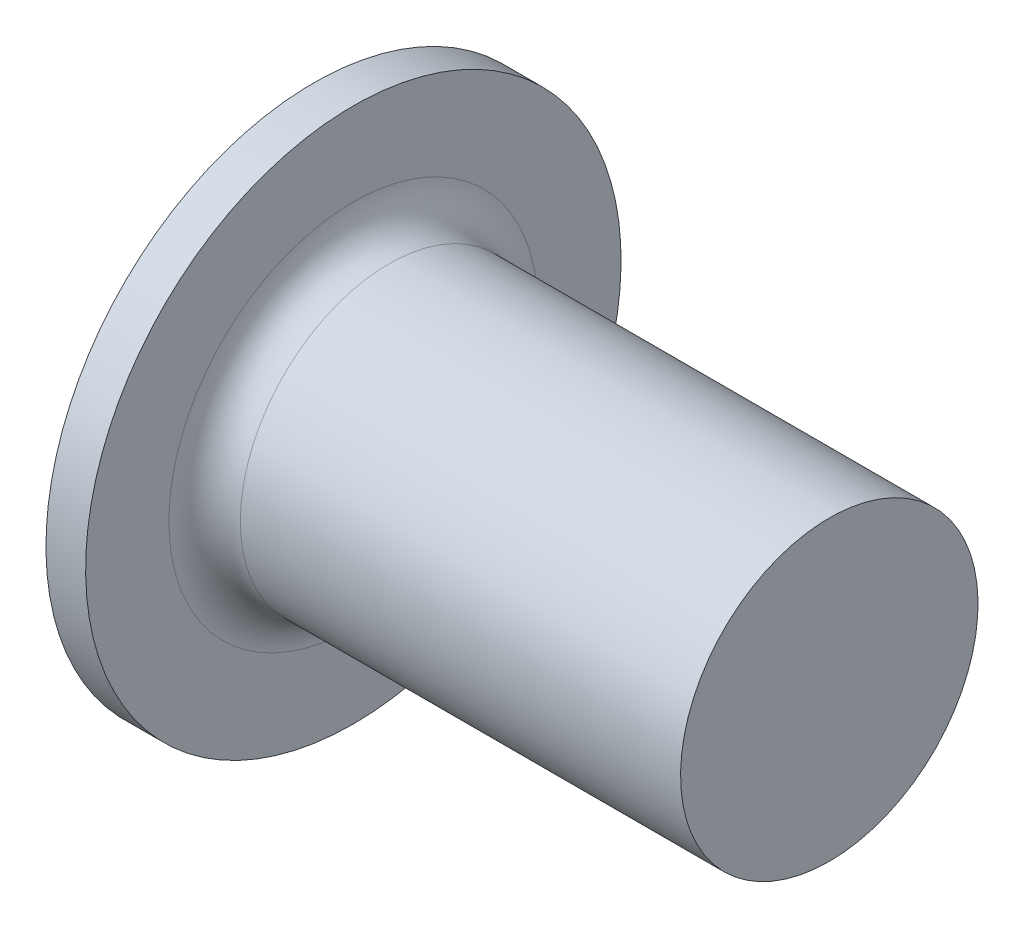
ISO-10303-21;
HEADER;
FILE_DESCRIPTION(('STEP AP214'),'2;1');
FILE_NAME('part.step','',(''),(''),'','','');
FILE_SCHEMA(('AUTOMOTIVE_DESIGN { 1 0 10303 214 1 1 1 1 }'));
ENDSEC;
DATA;
#1=APPLICATION_CONTEXT('core data for automotive mechanical design processes');
#2=APPLICATION_PROTOCOL_DEFINITION('international standard','automotive_design',2000,#1);
#3=PRODUCT_CONTEXT('',#1,'mechanical');
#4=PRODUCT('Part','Part','',(#3));
#5=PRODUCT_RELATED_PRODUCT_CATEGORY('part','',(#4));
#6=PRODUCT_DEFINITION_FORMATION('','',#4);
#7=PRODUCT_DEFINITION_CONTEXT('part definition',#1,'design');
#8=PRODUCT_DEFINITION('design','',#6,#7);
#9=PRODUCT_DEFINITION_SHAPE('','',#8);
#10=(LENGTH_UNIT() NAMED_UNIT(*) SI_UNIT(.MILLI.,.METRE.));
#11=(NAMED_UNIT(*) PLANE_ANGLE_UNIT() SI_UNIT($,.RADIAN.));
#12=(NAMED_UNIT(*) SI_UNIT($,.STERADIAN.) SOLID_ANGLE_UNIT());
#13=UNCERTAINTY_MEASURE_WITH_UNIT(LENGTH_MEASURE(1.E-05),#10,'distance_accuracy_value','');
#14=(GEOMETRIC_REPRESENTATION_CONTEXT(3) GLOBAL_UNCERTAINTY_ASSIGNED_CONTEXT((#13)) GLOBAL_UNIT_ASSIGNED_CONTEXT((#10,
#11,#12)) REPRESENTATION_CONTEXT('',''));
#15=CARTESIAN_POINT('',(0.,0.,0.));
#16=DIRECTION('',(0.,0.,1.));
#17=DIRECTION('',(1.,0.,0.));
#18=AXIS2_PLACEMENT_3D('',#15,#16,#17);
#19=CARTESIAN_POINT('',(-1.,0.,0.));
#20=DIRECTION('',(1.,0.,0.));
#21=DIRECTION('',(0.,1.,0.));
#22=AXIS2_PLACEMENT_3D('',#19,#20,#21);
#23=PLANE('',#22);
#24=CARTESIAN_POINT('',(-1.,0.,0.));
#25=DIRECTION('',(-1.,0.,0.));
#26=DIRECTION('',(0.,-1.,0.));
#27=AXIS2_PLACEMENT_3D('',#24,#25,#26);
#28=CIRCLE('',#27,3.92264973081038);
#29=CARTESIAN_POINT('',(-0.999999999999999,-3.92264973081038,0.));
#30=VERTEX_POINT('',#29);
#31=EDGE_CURVE('E212',#30,#30,#28,.T.);
#32=ORIENTED_EDGE('',*,*,#31,.T.);
#33=EDGE_LOOP('',(#32));
#34=FACE_BOUND('',#33,.T.);
#35=CARTESIAN_POINT('',(-1.,1.34625624391802,0.777261404824292));
#36=DIRECTION('',(-1.,0.,0.));
#37=DIRECTION('',(0.,0.,-1.));
#38=AXIS2_PLACEMENT_3D('',#35,#36,#37);
#39=CIRCLE('',#38,0.52952280964857);
#40=CARTESIAN_POINT('',(-1.,1.19825813867375,0.268841335607677));
#41=VERTEX_POINT('',#40);
#42=CARTESIAN_POINT('',(-1.,0.831952495560455,0.903301320579097));
#43=VERTEX_POINT('',#42);
#44=EDGE_CURVE('E51',#41,#43,#39,.T.);
#45=ORIENTED_EDGE('',*,*,#44,.T.);
#46=CARTESIAN_POINT('',(-1.,0.559999999999994,0.969948452238575));
#47=DIRECTION('',(1.,0.,0.));
#48=DIRECTION('',(0.,0.,-1.));
#49=AXIS2_PLACEMENT_3D('',#46,#47,#48);
#50=CIRCLE('',#49,0.279999999999998);
#51=CARTESIAN_POINT('',(-1.,0.366305643113291,1.17214265618677));
#52=VERTEX_POINT('',#51);
#53=EDGE_CURVE('E159',#43,#52,#50,.T.);
#54=ORIENTED_EDGE('',*,*,#53,.T.);
#55=CARTESIAN_POINT('',(-1.,0.,1.55452280964857));
#56=DIRECTION('',(-1.,0.,0.));
#57=DIRECTION('',(0.,0.,-1.));
#58=AXIS2_PLACEMENT_3D('',#55,#56,#57);
#59=CIRCLE('',#58,0.529522809648569);
#60=CARTESIAN_POINT('',(-1.,-0.366305643113293,1.17214265618677));
#61=VERTEX_POINT('',#60);
#62=EDGE_CURVE('E162',#52,#61,#59,.T.);
#63=ORIENTED_EDGE('',*,*,#62,.T.);
#64=CARTESIAN_POINT('',(-1.,-0.560000000000001,0.96994845223857));
#65=DIRECTION('',(1.,0.,0.));
#66=DIRECTION('',(0.,0.,-1.));
#67=AXIS2_PLACEMENT_3D('',#64,#65,#66);
#68=CIRCLE('',#67,0.280000000000001);
#69=CARTESIAN_POINT('',(-1.,-0.831952495560467,0.903301320579085));
#70=VERTEX_POINT('',#69);
#71=EDGE_CURVE('E165',#61,#70,#68,.T.);
#72=ORIENTED_EDGE('',*,*,#71,.T.);
#73=CARTESIAN_POINT('',(-1.,-1.34625624391801,0.777261404824274));
#74=DIRECTION('',(-1.,0.,0.));
#75=DIRECTION('',(0.,0.,-1.));
#76=AXIS2_PLACEMENT_3D('',#73,#74,#75);
#77=CIRCLE('',#76,0.529522809648555);
#78=CARTESIAN_POINT('',(-1.,-1.19825813867375,0.268841335607678));
#79=VERTEX_POINT('',#78);
#80=EDGE_CURVE('E168',#70,#79,#77,.T.);
#81=ORIENTED_EDGE('',*,*,#80,.T.);
#82=CARTESIAN_POINT('',(-1.,-1.12,0.));
#83=DIRECTION('',(1.,0.,0.));
#84=DIRECTION('',(0.,0.,-1.));
#85=AXIS2_PLACEMENT_3D('',#82,#83,#84);
#86=CIRCLE('',#85,0.280000000000001);
#87=CARTESIAN_POINT('',(-1.,-1.19825813867376,-0.26884133560768));
#88=VERTEX_POINT('',#87);
#89=EDGE_CURVE('E171',#79,#88,#86,.T.);
#90=ORIENTED_EDGE('',*,*,#89,.T.);
#91=CARTESIAN_POINT('',(-1.,-1.34625624391802,-0.777261404824292));
#92=DIRECTION('',(-1.,0.,0.));
#93=DIRECTION('',(0.,0.,-1.));
#94=AXIS2_PLACEMENT_3D('',#91,#92,#93);
#95=CIRCLE('',#94,0.52952280964857);
#96=CARTESIAN_POINT('',(-1.,-0.831952495560455,-0.903301320579097));
#97=VERTEX_POINT('',#96);
#98=EDGE_CURVE('E174',#88,#97,#95,.T.);
#99=ORIENTED_EDGE('',*,*,#98,.T.);
#100=CARTESIAN_POINT('',(-1.,-0.559999999999994,-0.969948452238575));
#101=DIRECTION('',(1.,0.,0.));
#102=DIRECTION('',(0.,0.,-1.));
#103=AXIS2_PLACEMENT_3D('',#100,#101,#102);
#104=CIRCLE('',#103,0.279999999999997);
#105=CARTESIAN_POINT('',(-1.,-0.366305643113292,-1.17214265618677));
#106=VERTEX_POINT('',#105);
#107=EDGE_CURVE('E177',#97,#106,#104,.T.);
#108=ORIENTED_EDGE('',*,*,#107,.T.);
#109=CARTESIAN_POINT('',(-1.,0.,-1.55452280964857));
#110=DIRECTION('',(-1.,0.,0.));
#111=DIRECTION('',(0.,0.,-1.));
#112=AXIS2_PLACEMENT_3D('',#109,#110,#111);
#113=CIRCLE('',#112,0.529522809648569);
#114=CARTESIAN_POINT('',(-1.,0.366305643113294,-1.17214265618677));
#115=VERTEX_POINT('',#114);
#116=EDGE_CURVE('E180',#106,#115,#113,.T.);
#117=ORIENTED_EDGE('',*,*,#116,.T.);
#118=CARTESIAN_POINT('',(-1.,0.560000000000001,-0.96994845223857));
#119=DIRECTION('',(1.,0.,0.));
#120=DIRECTION('',(0.,0.,-1.));
#121=AXIS2_PLACEMENT_3D('',#118,#119,#120);
#122=CIRCLE('',#121,0.28);
#123=CARTESIAN_POINT('',(-1.,0.831952495560466,-0.903301320579089));
#124=VERTEX_POINT('',#123);
#125=EDGE_CURVE('E183',#115,#124,#122,.T.);
#126=ORIENTED_EDGE('',*,*,#125,.T.);
#127=CARTESIAN_POINT('',(-1.,1.34625624391802,-0.777261404824281));
#128=DIRECTION('',(-1.,0.,0.));
#129=DIRECTION('',(0.,0.,-1.));
#130=AXIS2_PLACEMENT_3D('',#127,#128,#129);
#131=CIRCLE('',#130,0.529522809648569);
#132=CARTESIAN_POINT('',(-1.,1.19825813867376,-0.268841335607676));
#133=VERTEX_POINT('',#132);
#134=EDGE_CURVE('E149',#124,#133,#131,.T.);
#135=ORIENTED_EDGE('',*,*,#134,.T.);
#136=CARTESIAN_POINT('',(-1.,1.12,0.));
#137=DIRECTION('',(1.,0.,0.));
#138=DIRECTION('',(0.,0.,-1.));
#139=AXIS2_PLACEMENT_3D('',#136,#137,#138);
#140=CIRCLE('',#139,0.28);
#141=EDGE_CURVE('E186',#133,#41,#140,.T.);
#142=ORIENTED_EDGE('',*,*,#141,.T.);
#143=EDGE_LOOP('',(#45,#54,#63,#72,#81,#90,#99,#108,#117,#126,#135,#142));
#144=FACE_BOUND('',#143,.T.);
#145=ADVANCED_FACE('F36',(#34,#144),#23,.F.);
#146=CARTESIAN_POINT('',(0.,4.5,0.));
#147=DIRECTION('',(-1.,0.,0.));
#148=DIRECTION('',(0.,-1.,0.));
#149=AXIS2_PLACEMENT_3D('',#146,#147,#148);
#150=PLANE('',#149);
#151=CARTESIAN_POINT('',(0.,0.,0.));
#152=DIRECTION('',(-1.,0.,0.));
#153=DIRECTION('',(0.,-1.,0.));
#154=AXIS2_PLACEMENT_3D('',#151,#152,#153);
#155=CIRCLE('',#154,3.1);
#156=CARTESIAN_POINT('',(0.,-3.1,0.));
#157=VERTEX_POINT('',#156);
#158=EDGE_CURVE('E44',#157,#157,#155,.T.);
#159=ORIENTED_EDGE('',*,*,#158,.T.);
#160=EDGE_LOOP('',(#159));
#161=FACE_BOUND('',#160,.T.);
#162=CARTESIAN_POINT('',(0.,0.,0.));
#163=DIRECTION('',(-1.,0.,0.));
#164=DIRECTION('',(0.,-1.,0.));
#165=AXIS2_PLACEMENT_3D('',#162,#163,#164);
#166=CIRCLE('',#165,4.5);
#167=CARTESIAN_POINT('',(0.,-4.5,0.));
#168=VERTEX_POINT('',#167);
#169=EDGE_CURVE('E218',#168,#168,#166,.T.);
#170=ORIENTED_EDGE('',*,*,#169,.F.);
#171=EDGE_LOOP('',(#170));
#172=FACE_BOUND('',#171,.T.);
#173=ADVANCED_FACE('F223',(#161,#172),#150,.F.);
#174=CARTESIAN_POINT('',(-1.,0.,0.));
#175=DIRECTION('',(-1.,0.,0.));
#176=DIRECTION('',(0.,-1.,0.));
#177=AXIS2_PLACEMENT_3D('',#174,#175,#176);
#178=CYLINDRICAL_SURFACE('',#177,4.5);
#179=CARTESIAN_POINT('',(-0.666666666666666,0.,0.));
#180=DIRECTION('',(-1.,0.,0.));
#181=DIRECTION('',(0.,-1.,0.));
#182=AXIS2_PLACEMENT_3D('',#179,#180,#181);
#183=CIRCLE('',#182,4.5);
#184=CARTESIAN_POINT('',(-0.666666666666666,-4.5,0.));
#185=VERTEX_POINT('',#184);
#186=EDGE_CURVE('E215',#185,#185,#183,.T.);
#187=ORIENTED_EDGE('',*,*,#186,.F.);
#188=EDGE_LOOP('',(#187));
#189=FACE_BOUND('',#188,.T.);
#190=ORIENTED_EDGE('',*,*,#169,.T.);
#191=EDGE_LOOP('',(#190));
#192=FACE_BOUND('',#191,.T.);
#193=ADVANCED_FACE('F240',(#189,#192),#178,.T.);
#194=CARTESIAN_POINT('',(-0.666666666666666,0.,0.));
#195=DIRECTION('',(1.,0.,0.));
#196=DIRECTION('',(0.,1.,0.));
#197=AXIS2_PLACEMENT_3D('',#194,#195,#196);
#198=CONICAL_SURFACE('',#197,4.5,1.0471975511966);
#199=ORIENTED_EDGE('',*,*,#31,.F.);
#200=EDGE_LOOP('',(#199));
#201=FACE_BOUND('',#200,.T.);
#202=ORIENTED_EDGE('',*,*,#186,.T.);
#203=EDGE_LOOP('',(#202));
#204=FACE_BOUND('',#203,.T.);
#205=ADVANCED_FACE('F246',(#201,#204),#198,.T.);
#206=CARTESIAN_POINT('',(8.,2.5,0.));
#207=DIRECTION('',(-1.,0.,0.));
#208=DIRECTION('',(0.,-1.,0.));
#209=AXIS2_PLACEMENT_3D('',#206,#207,#208);
#210=PLANE('',#209);
#211=CARTESIAN_POINT('',(8.,0.,0.));
#212=DIRECTION('',(-1.,0.,0.));
#213=DIRECTION('',(0.,-1.,0.));
#214=AXIS2_PLACEMENT_3D('',#211,#212,#213);
#215=CIRCLE('',#214,2.5);
#216=CARTESIAN_POINT('',(8.,-2.5,0.));
#217=VERTEX_POINT('',#216);
#218=EDGE_CURVE('E209',#217,#217,#215,.T.);
#219=ORIENTED_EDGE('',*,*,#218,.F.);
#220=EDGE_LOOP('',(#219));
#221=FACE_BOUND('',#220,.T.);
#222=ADVANCED_FACE('F244',(#221),#210,.F.);
#223=CARTESIAN_POINT('',(-1.,0.,0.));
#224=DIRECTION('',(-1.,0.,0.));
#225=DIRECTION('',(0.,-1.,0.));
#226=AXIS2_PLACEMENT_3D('',#223,#224,#225);
#227=CYLINDRICAL_SURFACE('',#226,2.5);
#228=CARTESIAN_POINT('',(0.600000000000001,0.,0.));
#229=DIRECTION('',(-1.,0.,0.));
#230=DIRECTION('',(0.,-1.,0.));
#231=AXIS2_PLACEMENT_3D('',#228,#229,#230);
#232=CIRCLE('',#231,2.5);
#233=CARTESIAN_POINT('',(0.600000000000001,-2.5,0.));
#234=VERTEX_POINT('',#233);
#235=EDGE_CURVE('E11',#234,#234,#232,.F.);
#236=ORIENTED_EDGE('',*,*,#235,.T.);
#237=EDGE_LOOP('',(#236));
#238=FACE_BOUND('',#237,.T.);
#239=ORIENTED_EDGE('',*,*,#218,.T.);
#240=EDGE_LOOP('',(#239));
#241=FACE_BOUND('',#240,.T.);
#242=ADVANCED_FACE('F270',(#238,#241),#227,.T.);
#243=CARTESIAN_POINT('',(0.,1.34625624391802,0.777261404824292));
#244=DIRECTION('',(-1.,0.,0.));
#245=DIRECTION('',(0.,0.,1.));
#246=AXIS2_PLACEMENT_3D('',#243,#244,#245);
#247=CYLINDRICAL_SURFACE('',#246,0.52952280964857);
#248=ORIENTED_EDGE('',*,*,#44,.F.);
#249=DIRECTION('',(-1.,0.,0.));
#250=VECTOR('',#249,1.);
#251=CARTESIAN_POINT('',(0.,1.19825813867375,0.268841335607677));
#252=LINE('',#251,#250);
#253=CARTESIAN_POINT('',(0.,1.19825813867375,0.268841335607677));
#254=VERTEX_POINT('',#253);
#255=EDGE_CURVE('E154',#254,#41,#252,.T.);
#256=ORIENTED_EDGE('',*,*,#255,.F.);
#257=CARTESIAN_POINT('',(0.,1.34625624391802,0.777261404824292));
#258=DIRECTION('',(-1.,0.,0.));
#259=DIRECTION('',(0.,0.,-1.));
#260=AXIS2_PLACEMENT_3D('',#257,#258,#259);
#261=CIRCLE('',#260,0.52952280964857);
#262=CARTESIAN_POINT('',(0.,0.831952495560455,0.903301320579097));
#263=VERTEX_POINT('',#262);
#264=EDGE_CURVE('E189',#254,#263,#261,.T.);
#265=ORIENTED_EDGE('',*,*,#264,.T.);
#266=DIRECTION('',(-1.,0.,0.));
#267=VECTOR('',#266,1.);
#268=CARTESIAN_POINT('',(0.,0.831952495560455,0.903301320579097));
#269=LINE('',#268,#267);
#270=EDGE_CURVE('E207',#263,#43,#269,.T.);
#271=ORIENTED_EDGE('',*,*,#270,.T.);
#272=EDGE_LOOP('',(#248,#256,#265,#271));
#273=FACE_BOUND('',#272,.T.);
#274=ADVANCED_FACE('F277',(#273),#247,.T.);
#275=CARTESIAN_POINT('',(0.,0.559999999999994,0.969948452238575));
#276=DIRECTION('',(-1.,0.,0.));
#277=DIRECTION('',(0.,0.,1.));
#278=AXIS2_PLACEMENT_3D('',#275,#276,#277);
#279=CYLINDRICAL_SURFACE('',#278,0.279999999999998);
#280=ORIENTED_EDGE('',*,*,#53,.F.);
#281=ORIENTED_EDGE('',*,*,#270,.F.);
#282=CARTESIAN_POINT('',(0.,0.559999999999994,0.969948452238575));
#283=DIRECTION('',(1.,0.,0.));
#284=DIRECTION('',(0.,0.,-1.));
#285=AXIS2_PLACEMENT_3D('',#282,#283,#284);
#286=CIRCLE('',#285,0.279999999999998);
#287=CARTESIAN_POINT('',(0.,0.366305643113291,1.17214265618677));
#288=VERTEX_POINT('',#287);
#289=EDGE_CURVE('E108',#263,#288,#286,.T.);
#290=ORIENTED_EDGE('',*,*,#289,.T.);
#291=DIRECTION('',(-1.,0.,0.));
#292=VECTOR('',#291,1.);
#293=CARTESIAN_POINT('',(0.,0.366305643113291,1.17214265618677));
#294=LINE('',#293,#292);
#295=EDGE_CURVE('E205',#288,#52,#294,.T.);
#296=ORIENTED_EDGE('',*,*,#295,.T.);
#297=EDGE_LOOP('',(#280,#281,#290,#296));
#298=FACE_BOUND('',#297,.T.);
#299=ADVANCED_FACE('F285',(#298),#279,.F.);
#300=CARTESIAN_POINT('',(0.,0.,1.55452280964857));
#301=DIRECTION('',(-1.,0.,0.));
#302=DIRECTION('',(0.,0.,1.));
#303=AXIS2_PLACEMENT_3D('',#300,#301,#302);
#304=CYLINDRICAL_SURFACE('',#303,0.529522809648569);
#305=ORIENTED_EDGE('',*,*,#62,.F.);
#306=ORIENTED_EDGE('',*,*,#295,.F.);
#307=CARTESIAN_POINT('',(0.,0.,1.55452280964857));
#308=DIRECTION('',(-1.,0.,0.));
#309=DIRECTION('',(0.,0.,-1.));
#310=AXIS2_PLACEMENT_3D('',#307,#308,#309);
#311=CIRCLE('',#310,0.529522809648569);
#312=CARTESIAN_POINT('',(0.,-0.366305643113293,1.17214265618677));
#313=VERTEX_POINT('',#312);
#314=EDGE_CURVE('E436',#288,#313,#311,.T.);
#315=ORIENTED_EDGE('',*,*,#314,.T.);
#316=DIRECTION('',(-1.,0.,0.));
#317=VECTOR('',#316,1.);
#318=CARTESIAN_POINT('',(0.,-0.366305643113293,1.17214265618677));
#319=LINE('',#318,#317);
#320=EDGE_CURVE('E203',#313,#61,#319,.T.);
#321=ORIENTED_EDGE('',*,*,#320,.T.);
#322=EDGE_LOOP('',(#305,#306,#315,#321));
#323=FACE_BOUND('',#322,.T.);
#324=ADVANCED_FACE('F292',(#323),#304,.T.);
#325=CARTESIAN_POINT('',(0.,-0.560000000000001,0.96994845223857));
#326=DIRECTION('',(-1.,0.,0.));
#327=DIRECTION('',(0.,0.,1.));
#328=AXIS2_PLACEMENT_3D('',#325,#326,#327);
#329=CYLINDRICAL_SURFACE('',#328,0.280000000000001);
#330=ORIENTED_EDGE('',*,*,#71,.F.);
#331=ORIENTED_EDGE('',*,*,#320,.F.);
#332=CARTESIAN_POINT('',(0.,-0.560000000000001,0.96994845223857));
#333=DIRECTION('',(1.,0.,0.));
#334=DIRECTION('',(0.,0.,-1.));
#335=AXIS2_PLACEMENT_3D('',#332,#333,#334);
#336=CIRCLE('',#335,0.280000000000001);
#337=CARTESIAN_POINT('',(0.,-0.831952495560467,0.903301320579085));
#338=VERTEX_POINT('',#337);
#339=EDGE_CURVE('E434',#313,#338,#336,.T.);
#340=ORIENTED_EDGE('',*,*,#339,.T.);
#341=DIRECTION('',(-1.,0.,0.));
#342=VECTOR('',#341,1.);
#343=CARTESIAN_POINT('',(0.,-0.831952495560467,0.903301320579085));
#344=LINE('',#343,#342);
#345=EDGE_CURVE('E201',#338,#70,#344,.T.);
#346=ORIENTED_EDGE('',*,*,#345,.T.);
#347=EDGE_LOOP('',(#330,#331,#340,#346));
#348=FACE_BOUND('',#347,.T.);
#349=ADVANCED_FACE('F300',(#348),#329,.F.);
#350=CARTESIAN_POINT('',(0.,-1.34625624391801,0.777261404824274));
#351=DIRECTION('',(-1.,0.,0.));
#352=DIRECTION('',(0.,0.,1.));
#353=AXIS2_PLACEMENT_3D('',#350,#351,#352);
#354=CYLINDRICAL_SURFACE('',#353,0.529522809648555);
#355=ORIENTED_EDGE('',*,*,#80,.F.);
#356=ORIENTED_EDGE('',*,*,#345,.F.);
#357=CARTESIAN_POINT('',(0.,-1.34625624391801,0.777261404824274));
#358=DIRECTION('',(-1.,0.,0.));
#359=DIRECTION('',(0.,0.,-1.));
#360=AXIS2_PLACEMENT_3D('',#357,#358,#359);
#361=CIRCLE('',#360,0.529522809648555);
#362=CARTESIAN_POINT('',(0.,-1.19825813867375,0.268841335607678));
#363=VERTEX_POINT('',#362);
#364=EDGE_CURVE('E432',#338,#363,#361,.T.);
#365=ORIENTED_EDGE('',*,*,#364,.T.);
#366=DIRECTION('',(-1.,0.,0.));
#367=VECTOR('',#366,1.);
#368=CARTESIAN_POINT('',(0.,-1.19825813867375,0.268841335607678));
#369=LINE('',#368,#367);
#370=EDGE_CURVE('E199',#363,#79,#369,.T.);
#371=ORIENTED_EDGE('',*,*,#370,.T.);
#372=EDGE_LOOP('',(#355,#356,#365,#371));
#373=FACE_BOUND('',#372,.T.);
#374=ADVANCED_FACE('F308',(#373),#354,.T.);
#375=CARTESIAN_POINT('',(0.,-1.12,0.));
#376=DIRECTION('',(-1.,0.,0.));
#377=DIRECTION('',(0.,0.,1.));
#378=AXIS2_PLACEMENT_3D('',#375,#376,#377);
#379=CYLINDRICAL_SURFACE('',#378,0.280000000000001);
#380=ORIENTED_EDGE('',*,*,#89,.F.);
#381=ORIENTED_EDGE('',*,*,#370,.F.);
#382=CARTESIAN_POINT('',(0.,-1.12,0.));
#383=DIRECTION('',(1.,0.,0.));
#384=DIRECTION('',(0.,0.,-1.));
#385=AXIS2_PLACEMENT_3D('',#382,#383,#384);
#386=CIRCLE('',#385,0.280000000000001);
#387=CARTESIAN_POINT('',(0.,-1.19825813867376,-0.26884133560768));
#388=VERTEX_POINT('',#387);
#389=EDGE_CURVE('E430',#363,#388,#386,.T.);
#390=ORIENTED_EDGE('',*,*,#389,.T.);
#391=DIRECTION('',(-1.,0.,0.));
#392=VECTOR('',#391,1.);
#393=CARTESIAN_POINT('',(0.,-1.19825813867376,-0.26884133560768));
#394=LINE('',#393,#392);
#395=EDGE_CURVE('E197',#388,#88,#394,.T.);
#396=ORIENTED_EDGE('',*,*,#395,.T.);
#397=EDGE_LOOP('',(#380,#381,#390,#396));
#398=FACE_BOUND('',#397,.T.);
#399=ADVANCED_FACE('F316',(#398),#379,.F.);
#400=CARTESIAN_POINT('',(0.,-1.34625624391802,-0.777261404824292));
#401=DIRECTION('',(-1.,0.,0.));
#402=DIRECTION('',(0.,0.,1.));
#403=AXIS2_PLACEMENT_3D('',#400,#401,#402);
#404=CYLINDRICAL_SURFACE('',#403,0.52952280964857);
#405=ORIENTED_EDGE('',*,*,#98,.F.);
#406=ORIENTED_EDGE('',*,*,#395,.F.);
#407=CARTESIAN_POINT('',(0.,-1.34625624391802,-0.777261404824292));
#408=DIRECTION('',(-1.,0.,0.));
#409=DIRECTION('',(0.,0.,-1.));
#410=AXIS2_PLACEMENT_3D('',#407,#408,#409);
#411=CIRCLE('',#410,0.52952280964857);
#412=CARTESIAN_POINT('',(0.,-0.831952495560455,-0.903301320579097));
#413=VERTEX_POINT('',#412);
#414=EDGE_CURVE('E426',#388,#413,#411,.T.);
#415=ORIENTED_EDGE('',*,*,#414,.T.);
#416=DIRECTION('',(-1.,0.,0.));
#417=VECTOR('',#416,1.);
#418=CARTESIAN_POINT('',(0.,-0.831952495560455,-0.903301320579097));
#419=LINE('',#418,#417);
#420=EDGE_CURVE('E195',#413,#97,#419,.T.);
#421=ORIENTED_EDGE('',*,*,#420,.T.);
#422=EDGE_LOOP('',(#405,#406,#415,#421));
#423=FACE_BOUND('',#422,.T.);
#424=ADVANCED_FACE('F324',(#423),#404,.T.);
#425=CARTESIAN_POINT('',(0.,-0.559999999999994,-0.969948452238575));
#426=DIRECTION('',(-1.,0.,0.));
#427=DIRECTION('',(0.,0.,1.));
#428=AXIS2_PLACEMENT_3D('',#425,#426,#427);
#429=CYLINDRICAL_SURFACE('',#428,0.279999999999997);
#430=ORIENTED_EDGE('',*,*,#107,.F.);
#431=ORIENTED_EDGE('',*,*,#420,.F.);
#432=CARTESIAN_POINT('',(0.,-0.559999999999994,-0.969948452238575));
#433=DIRECTION('',(1.,0.,0.));
#434=DIRECTION('',(0.,0.,-1.));
#435=AXIS2_PLACEMENT_3D('',#432,#433,#434);
#436=CIRCLE('',#435,0.279999999999997);
#437=CARTESIAN_POINT('',(0.,-0.366305643113292,-1.17214265618677));
#438=VERTEX_POINT('',#437);
#439=EDGE_CURVE('E425',#413,#438,#436,.T.);
#440=ORIENTED_EDGE('',*,*,#439,.T.);
#441=DIRECTION('',(-1.,0.,0.));
#442=VECTOR('',#441,1.);
#443=CARTESIAN_POINT('',(0.,-0.366305643113292,-1.17214265618677));
#444=LINE('',#443,#442);
#445=EDGE_CURVE('E193',#438,#106,#444,.T.);
#446=ORIENTED_EDGE('',*,*,#445,.T.);
#447=EDGE_LOOP('',(#430,#431,#440,#446));
#448=FACE_BOUND('',#447,.T.);
#449=ADVANCED_FACE('F332',(#448),#429,.F.);
#450=CARTESIAN_POINT('',(0.,0.,-1.55452280964857));
#451=DIRECTION('',(-1.,0.,0.));
#452=DIRECTION('',(0.,0.,1.));
#453=AXIS2_PLACEMENT_3D('',#450,#451,#452);
#454=CYLINDRICAL_SURFACE('',#453,0.529522809648569);
#455=ORIENTED_EDGE('',*,*,#116,.F.);
#456=ORIENTED_EDGE('',*,*,#445,.F.);
#457=CARTESIAN_POINT('',(0.,0.,-1.55452280964857));
#458=DIRECTION('',(-1.,0.,0.));
#459=DIRECTION('',(0.,0.,-1.));
#460=AXIS2_PLACEMENT_3D('',#457,#458,#459);
#461=CIRCLE('',#460,0.529522809648569);
#462=CARTESIAN_POINT('',(0.,0.366305643113294,-1.17214265618677));
#463=VERTEX_POINT('',#462);
#464=EDGE_CURVE('E145',#438,#463,#461,.T.);
#465=ORIENTED_EDGE('',*,*,#464,.T.);
#466=DIRECTION('',(-1.,0.,0.));
#467=VECTOR('',#466,1.);
#468=CARTESIAN_POINT('',(0.,0.366305643113294,-1.17214265618677));
#469=LINE('',#468,#467);
#470=EDGE_CURVE('E141',#463,#115,#469,.T.);
#471=ORIENTED_EDGE('',*,*,#470,.T.);
#472=EDGE_LOOP('',(#455,#456,#465,#471));
#473=FACE_BOUND('',#472,.T.);
#474=ADVANCED_FACE('F340',(#473),#454,.T.);
#475=CARTESIAN_POINT('',(0.,0.560000000000001,-0.96994845223857));
#476=DIRECTION('',(-1.,0.,0.));
#477=DIRECTION('',(0.,0.,1.));
#478=AXIS2_PLACEMENT_3D('',#475,#476,#477);
#479=CYLINDRICAL_SURFACE('',#478,0.28);
#480=ORIENTED_EDGE('',*,*,#125,.F.);
#481=ORIENTED_EDGE('',*,*,#470,.F.);
#482=CARTESIAN_POINT('',(0.,0.560000000000001,-0.96994845223857));
#483=DIRECTION('',(1.,0.,0.));
#484=DIRECTION('',(0.,0.,-1.));
#485=AXIS2_PLACEMENT_3D('',#482,#483,#484);
#486=CIRCLE('',#485,0.28);
#487=CARTESIAN_POINT('',(0.,0.831952495560466,-0.903301320579089));
#488=VERTEX_POINT('',#487);
#489=EDGE_CURVE('E136',#463,#488,#486,.T.);
#490=ORIENTED_EDGE('',*,*,#489,.T.);
#491=DIRECTION('',(-1.,0.,0.));
#492=VECTOR('',#491,1.);
#493=CARTESIAN_POINT('',(0.,0.831952495560466,-0.903301320579089));
#494=LINE('',#493,#492);
#495=EDGE_CURVE('E140',#488,#124,#494,.T.);
#496=ORIENTED_EDGE('',*,*,#495,.T.);
#497=EDGE_LOOP('',(#480,#481,#490,#496));
#498=FACE_BOUND('',#497,.T.);
#499=ADVANCED_FACE('F139',(#498),#479,.F.);
#500=CARTESIAN_POINT('',(0.,1.34625624391802,-0.777261404824281));
#501=DIRECTION('',(-1.,0.,0.));
#502=DIRECTION('',(0.,0.,1.));
#503=AXIS2_PLACEMENT_3D('',#500,#501,#502);
#504=CYLINDRICAL_SURFACE('',#503,0.529522809648569);
#505=ORIENTED_EDGE('',*,*,#134,.F.);
#506=ORIENTED_EDGE('',*,*,#495,.F.);
#507=CARTESIAN_POINT('',(0.,1.34625624391802,-0.777261404824281));
#508=DIRECTION('',(-1.,0.,0.));
#509=DIRECTION('',(0.,0.,-1.));
#510=AXIS2_PLACEMENT_3D('',#507,#508,#509);
#511=CIRCLE('',#510,0.529522809648569);
#512=CARTESIAN_POINT('',(0.,1.19825813867376,-0.268841335607676));
#513=VERTEX_POINT('',#512);
#514=EDGE_CURVE('E144',#488,#513,#511,.T.);
#515=ORIENTED_EDGE('',*,*,#514,.T.);
#516=DIRECTION('',(-1.,0.,0.));
#517=VECTOR('',#516,1.);
#518=CARTESIAN_POINT('',(0.,1.19825813867376,-0.268841335607676));
#519=LINE('',#518,#517);
#520=EDGE_CURVE('E99',#513,#133,#519,.T.);
#521=ORIENTED_EDGE('',*,*,#520,.T.);
#522=EDGE_LOOP('',(#505,#506,#515,#521));
#523=FACE_BOUND('',#522,.T.);
#524=ADVANCED_FACE('F147',(#523),#504,.T.);
#525=CARTESIAN_POINT('',(0.,1.12,0.));
#526=DIRECTION('',(-1.,0.,0.));
#527=DIRECTION('',(0.,0.,1.));
#528=AXIS2_PLACEMENT_3D('',#525,#526,#527);
#529=CYLINDRICAL_SURFACE('',#528,0.28);
#530=ORIENTED_EDGE('',*,*,#141,.F.);
#531=ORIENTED_EDGE('',*,*,#520,.F.);
#532=CARTESIAN_POINT('',(0.,1.12,0.));
#533=DIRECTION('',(1.,0.,0.));
#534=DIRECTION('',(0.,0.,-1.));
#535=AXIS2_PLACEMENT_3D('',#532,#533,#534);
#536=CIRCLE('',#535,0.28);
#537=EDGE_CURVE('E59',#513,#254,#536,.T.);
#538=ORIENTED_EDGE('',*,*,#537,.T.);
#539=ORIENTED_EDGE('',*,*,#255,.T.);
#540=EDGE_LOOP('',(#530,#531,#538,#539));
#541=FACE_BOUND('',#540,.T.);
#542=ADVANCED_FACE('F231',(#541),#529,.F.);
#543=CARTESIAN_POINT('',(0.,1.23312812195901,0.388630702412146));
#544=DIRECTION('',(1.,0.,0.));
#545=DIRECTION('',(0.,0.,-1.));
#546=AXIS2_PLACEMENT_3D('',#543,#544,#545);
#547=PLANE('',#546);
#548=ORIENTED_EDGE('',*,*,#264,.F.);
#549=ORIENTED_EDGE('',*,*,#537,.F.);
#550=ORIENTED_EDGE('',*,*,#514,.F.);
#551=ORIENTED_EDGE('',*,*,#489,.F.);
#552=ORIENTED_EDGE('',*,*,#464,.F.);
#553=ORIENTED_EDGE('',*,*,#439,.F.);
#554=ORIENTED_EDGE('',*,*,#414,.F.);
#555=ORIENTED_EDGE('',*,*,#389,.F.);
#556=ORIENTED_EDGE('',*,*,#364,.F.);
#557=ORIENTED_EDGE('',*,*,#339,.F.);
#558=ORIENTED_EDGE('',*,*,#314,.F.);
#559=ORIENTED_EDGE('',*,*,#289,.F.);
#560=EDGE_LOOP('',(#548,#549,#550,#551,#552,#553,#554,#555,#556,#557,#558,#559));
#561=FACE_BOUND('',#560,.T.);
#562=ADVANCED_FACE('F152',(#561),#547,.F.);
#563=CARTESIAN_POINT('',(0.6,0.,0.));
#564=DIRECTION('',(-1.,0.,0.));
#565=DIRECTION('',(0.,-1.,0.));
#566=AXIS2_PLACEMENT_3D('',#563,#564,#565);
#567=TOROIDAL_SURFACE('',#566,3.1,0.6);
#568=ORIENTED_EDGE('',*,*,#235,.F.);
#569=EDGE_LOOP('',(#568));
#570=FACE_BOUND('',#569,.T.);
#571=ORIENTED_EDGE('',*,*,#158,.F.);
#572=EDGE_LOOP('',(#571));
#573=FACE_BOUND('',#572,.T.);
#574=ADVANCED_FACE('F38',(#570,#573),#567,.F.);
#575=CLOSED_SHELL('',(#145,#173,#193,#205,#222,#242,#274,#299,#324,#349,#374,#399,#424,#449,
#474,#499,#524,#542,#562,#574));
#576=MANIFOLD_SOLID_BREP('B2',#575);
#577=ADVANCED_BREP_SHAPE_REPRESENTATION('',(#18,#576),#14);
#578=SHAPE_DEFINITION_REPRESENTATION(#9,#577);
ENDSEC;
END-ISO-10303-21;
